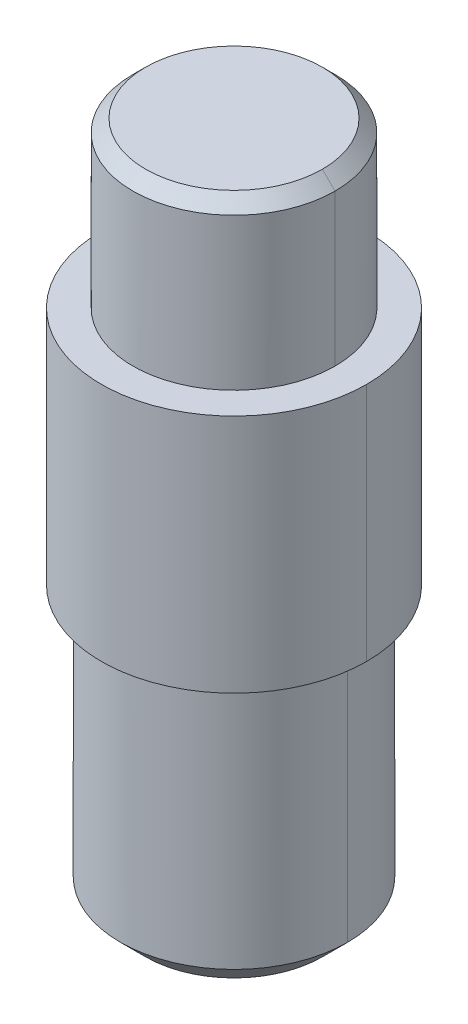
ISO-10303-21;
HEADER;
FILE_DESCRIPTION(('STEP AP214'),'2;1');
FILE_NAME('part.step','',(''),(''),'','','');
FILE_SCHEMA(('AUTOMOTIVE_DESIGN { 1 0 10303 214 1 1 1 1 }'));
ENDSEC;
DATA;
#1=APPLICATION_CONTEXT('core data for automotive mechanical design processes');
#2=APPLICATION_PROTOCOL_DEFINITION('international standard','automotive_design',2000,#1);
#3=PRODUCT_CONTEXT('',#1,'mechanical');
#4=PRODUCT('Part','Part','',(#3));
#5=PRODUCT_RELATED_PRODUCT_CATEGORY('part','',(#4));
#6=PRODUCT_DEFINITION_FORMATION('','',#4);
#7=PRODUCT_DEFINITION_CONTEXT('part definition',#1,'design');
#8=PRODUCT_DEFINITION('design','',#6,#7);
#9=PRODUCT_DEFINITION_SHAPE('','',#8);
#10=(LENGTH_UNIT() NAMED_UNIT(*) SI_UNIT(.MILLI.,.METRE.));
#11=(NAMED_UNIT(*) PLANE_ANGLE_UNIT() SI_UNIT($,.RADIAN.));
#12=(NAMED_UNIT(*) SI_UNIT($,.STERADIAN.) SOLID_ANGLE_UNIT());
#13=UNCERTAINTY_MEASURE_WITH_UNIT(LENGTH_MEASURE(1.E-05),#10,'distance_accuracy_value','');
#14=(GEOMETRIC_REPRESENTATION_CONTEXT(3) GLOBAL_UNCERTAINTY_ASSIGNED_CONTEXT((#13)) GLOBAL_UNIT_ASSIGNED_CONTEXT((#10,
#11,#12)) REPRESENTATION_CONTEXT('',''));
#15=CARTESIAN_POINT('',(0.,0.,0.));
#16=DIRECTION('',(0.,0.,1.));
#17=DIRECTION('',(1.,0.,0.));
#18=AXIS2_PLACEMENT_3D('',#15,#16,#17);
#19=CARTESIAN_POINT('',(0.,0.,0.));
#20=DIRECTION('',(0.,1.,0.));
#21=DIRECTION('',(1.,0.,0.));
#22=AXIS2_PLACEMENT_3D('',#19,#20,#21);
#23=PLANE('',#22);
#24=CARTESIAN_POINT('',(0.,-1.50990331349E-13,0.));
#25=DIRECTION('',(0.,1.,0.));
#26=DIRECTION('',(0.,0.,1.));
#27=AXIS2_PLACEMENT_3D('',#24,#25,#26);
#28=CIRCLE('',#27,3.5);
#29=CARTESIAN_POINT('',(0.,-1.50990331349E-13,3.5));
#30=VERTEX_POINT('',#29);
#31=CARTESIAN_POINT('',(3.5,-1.50990331349E-13,0.));
#32=VERTEX_POINT('',#31);
#33=EDGE_CURVE('E42',#30,#32,#28,.T.);
#34=ORIENTED_EDGE('',*,*,#33,.F.);
#35=CARTESIAN_POINT('',(0.,-1.50990331349E-13,0.));
#36=DIRECTION('',(0.,1.,0.));
#37=DIRECTION('',(-1.,0.,0.));
#38=AXIS2_PLACEMENT_3D('',#35,#36,#37);
#39=CIRCLE('',#38,3.5);
#40=CARTESIAN_POINT('',(-3.5,-1.50990331349E-13,0.));
#41=VERTEX_POINT('',#40);
#42=EDGE_CURVE('E161',#41,#30,#39,.T.);
#43=ORIENTED_EDGE('',*,*,#42,.F.);
#44=CARTESIAN_POINT('',(0.,-1.50990331349E-13,0.));
#45=DIRECTION('',(0.,1.,0.));
#46=DIRECTION('',(0.,0.,-1.));
#47=AXIS2_PLACEMENT_3D('',#44,#45,#46);
#48=CIRCLE('',#47,3.5);
#49=CARTESIAN_POINT('',(0.,-1.50990331349E-13,-3.5));
#50=VERTEX_POINT('',#49);
#51=EDGE_CURVE('E159',#50,#41,#48,.T.);
#52=ORIENTED_EDGE('',*,*,#51,.F.);
#53=CARTESIAN_POINT('',(0.,-1.50990331349E-13,0.));
#54=DIRECTION('',(0.,1.,0.));
#55=DIRECTION('',(1.,0.,0.));
#56=AXIS2_PLACEMENT_3D('',#53,#54,#55);
#57=CIRCLE('',#56,3.5);
#58=EDGE_CURVE('E28',#32,#50,#57,.T.);
#59=ORIENTED_EDGE('',*,*,#58,.F.);
#60=EDGE_LOOP('',(#34,#43,#52,#59));
#61=FACE_BOUND('',#60,.T.);
#62=ADVANCED_FACE('F17',(#61),#23,.F.);
#63=CARTESIAN_POINT('',(0.,0.4999999999999,0.));
#64=DIRECTION('',(0.,1.,0.));
#65=DIRECTION('',(0.,0.,-1.));
#66=AXIS2_PLACEMENT_3D('',#63,#64,#65);
#67=CONICAL_SURFACE('',#66,4.,0.7853981633973);
#68=DIRECTION('',(0.707106781186498,-0.707106781186597,-5.68588450313498E-12));
#69=VECTOR('',#68,1.);
#70=CARTESIAN_POINT('',(-4.5,0.9999999999999,-2.171026979362E-10));
#71=LINE('',#70,#69);
#72=CARTESIAN_POINT('',(-4.5,0.9999999999998,0.));
#73=VERTEX_POINT('',#72);
#74=EDGE_CURVE('E150',#73,#41,#71,.T.);
#75=ORIENTED_EDGE('',*,*,#74,.F.);
#76=CARTESIAN_POINT('',(0.,0.9999999999998,0.));
#77=DIRECTION('',(0.,1.,0.));
#78=DIRECTION('',(0.,0.,-1.));
#79=AXIS2_PLACEMENT_3D('',#76,#77,#78);
#80=CIRCLE('',#79,4.5);
#81=CARTESIAN_POINT('',(0.,0.9999999999998,-4.5));
#82=VERTEX_POINT('',#81);
#83=EDGE_CURVE('E128',#82,#73,#80,.T.);
#84=ORIENTED_EDGE('',*,*,#83,.F.);
#85=CARTESIAN_POINT('',(0.,0.9999999999998,0.));
#86=DIRECTION('',(0.,1.,0.));
#87=DIRECTION('',(1.,0.,4.202093083896E-11));
#88=AXIS2_PLACEMENT_3D('',#85,#86,#87);
#89=CIRCLE('',#88,4.5);
#90=CARTESIAN_POINT('',(4.5,0.9999999999999,3.11649568269E-10));
#91=VERTEX_POINT('',#90);
#92=EDGE_CURVE('E140',#91,#82,#89,.T.);
#93=ORIENTED_EDGE('',*,*,#92,.F.);
#94=DIRECTION('',(-0.707106781186498,-0.707106781186597,-6.11692150040798E-11));
#95=VECTOR('',#94,1.);
#96=CARTESIAN_POINT('',(4.5,0.9999999999999,3.11649568269E-10));
#97=LINE('',#96,#95);
#98=EDGE_CURVE('E11',#91,#32,#97,.T.);
#99=ORIENTED_EDGE('',*,*,#98,.T.);
#100=ORIENTED_EDGE('',*,*,#58,.T.);
#101=ORIENTED_EDGE('',*,*,#51,.T.);
#102=EDGE_LOOP('',(#75,#84,#93,#99,#100,#101));
#103=FACE_BOUND('',#102,.T.);
#104=ADVANCED_FACE('F156',(#103),#67,.T.);
#105=CARTESIAN_POINT('',(0.,0.4999999999999,0.));
#106=DIRECTION('',(0.,1.,0.));
#107=DIRECTION('',(0.,0.,-1.));
#108=AXIS2_PLACEMENT_3D('',#105,#106,#107);
#109=CONICAL_SURFACE('',#108,4.,0.7853981633973);
#110=ORIENTED_EDGE('',*,*,#98,.F.);
#111=CARTESIAN_POINT('',(0.,0.9999999999998,0.));
#112=DIRECTION('',(0.,1.,0.));
#113=DIRECTION('',(0.,0.,1.));
#114=AXIS2_PLACEMENT_3D('',#111,#112,#113);
#115=CIRCLE('',#114,4.5);
#116=CARTESIAN_POINT('',(0.,0.9999999999998,4.5));
#117=VERTEX_POINT('',#116);
#118=EDGE_CURVE('E152',#117,#91,#115,.T.);
#119=ORIENTED_EDGE('',*,*,#118,.F.);
#120=CARTESIAN_POINT('',(0.,0.9999999999998,0.));
#121=DIRECTION('',(0.,1.,0.));
#122=DIRECTION('',(-1.,0.,0.));
#123=AXIS2_PLACEMENT_3D('',#120,#121,#122);
#124=CIRCLE('',#123,4.5);
#125=EDGE_CURVE('E147',#73,#117,#124,.T.);
#126=ORIENTED_EDGE('',*,*,#125,.F.);
#127=ORIENTED_EDGE('',*,*,#74,.T.);
#128=ORIENTED_EDGE('',*,*,#42,.T.);
#129=ORIENTED_EDGE('',*,*,#33,.T.);
#130=EDGE_LOOP('',(#110,#119,#126,#127,#128,#129));
#131=FACE_BOUND('',#130,.T.);
#132=ADVANCED_FACE('F149',(#131),#109,.T.);
#133=CARTESIAN_POINT('',(0.,0.,0.));
#134=DIRECTION('',(0.,-1.,0.));
#135=DIRECTION('',(-1.,0.,0.));
#136=AXIS2_PLACEMENT_3D('',#133,#134,#135);
#137=CYLINDRICAL_SURFACE('',#136,4.5);
#138=DIRECTION('',(0.,-1.,1.855866841859E-11));
#139=VECTOR('',#138,1.);
#140=CARTESIAN_POINT('',(4.5,11.,1.260628840831E-10));
#141=LINE('',#140,#139);
#142=CARTESIAN_POINT('',(4.5,11.,0.));
#143=VERTEX_POINT('',#142);
#144=EDGE_CURVE('E251',#143,#91,#141,.T.);
#145=ORIENTED_EDGE('',*,*,#144,.F.);
#146=CARTESIAN_POINT('',(0.,11.,0.));
#147=DIRECTION('',(0.,-1.,0.));
#148=DIRECTION('',(1.,0.,0.));
#149=AXIS2_PLACEMENT_3D('',#146,#147,#148);
#150=CIRCLE('',#149,4.5);
#151=CARTESIAN_POINT('',(-4.5,11.,0.));
#152=VERTEX_POINT('',#151);
#153=EDGE_CURVE('E165',#143,#152,#150,.T.);
#154=ORIENTED_EDGE('',*,*,#153,.T.);
#155=DIRECTION('',(0.,-1.,-2.17102973764E-11));
#156=VECTOR('',#155,1.);
#157=CARTESIAN_POINT('',(-4.5,11.,0.));
#158=LINE('',#157,#156);
#159=EDGE_CURVE('E137',#152,#73,#158,.T.);
#160=ORIENTED_EDGE('',*,*,#159,.T.);
#161=ORIENTED_EDGE('',*,*,#125,.T.);
#162=ORIENTED_EDGE('',*,*,#118,.T.);
#163=EDGE_LOOP('',(#145,#154,#160,#161,#162));
#164=FACE_BOUND('',#163,.T.);
#165=ADVANCED_FACE('F163',(#164),#137,.T.);
#166=CARTESIAN_POINT('',(0.,0.,0.));
#167=DIRECTION('',(0.,-1.,0.));
#168=DIRECTION('',(-1.,0.,0.));
#169=AXIS2_PLACEMENT_3D('',#166,#167,#168);
#170=CYLINDRICAL_SURFACE('',#169,4.5);
#171=ORIENTED_EDGE('',*,*,#159,.F.);
#172=CARTESIAN_POINT('',(0.,11.,0.));
#173=DIRECTION('',(0.,-1.,0.));
#174=DIRECTION('',(-1.,0.,0.));
#175=AXIS2_PLACEMENT_3D('',#172,#173,#174);
#176=CIRCLE('',#175,4.5);
#177=EDGE_CURVE('E224',#152,#143,#176,.T.);
#178=ORIENTED_EDGE('',*,*,#177,.T.);
#179=ORIENTED_EDGE('',*,*,#144,.T.);
#180=ORIENTED_EDGE('',*,*,#92,.T.);
#181=ORIENTED_EDGE('',*,*,#83,.T.);
#182=EDGE_LOOP('',(#171,#178,#179,#180,#181));
#183=FACE_BOUND('',#182,.T.);
#184=ADVANCED_FACE('F134',(#183),#170,.T.);
#185=CARTESIAN_POINT('',(0.,11.,0.));
#186=DIRECTION('',(0.,-1.,0.));
#187=DIRECTION('',(0.,0.,-1.));
#188=AXIS2_PLACEMENT_3D('',#185,#186,#187);
#189=PLANE('',#188);
#190=CARTESIAN_POINT('',(0.,11.,0.));
#191=DIRECTION('',(0.,1.,0.));
#192=DIRECTION('',(-1.,0.,0.));
#193=AXIS2_PLACEMENT_3D('',#190,#191,#192);
#194=CIRCLE('',#193,5.25);
#195=CARTESIAN_POINT('',(-5.25,11.,0.));
#196=VERTEX_POINT('',#195);
#197=CARTESIAN_POINT('',(5.25,11.,0.));
#198=VERTEX_POINT('',#197);
#199=EDGE_CURVE('E181',#196,#198,#194,.T.);
#200=ORIENTED_EDGE('',*,*,#199,.F.);
#201=CARTESIAN_POINT('',(0.,11.,0.));
#202=DIRECTION('',(0.,1.,0.));
#203=DIRECTION('',(1.,0.,0.));
#204=AXIS2_PLACEMENT_3D('',#201,#202,#203);
#205=CIRCLE('',#204,5.25);
#206=EDGE_CURVE('E174',#198,#196,#205,.T.);
#207=ORIENTED_EDGE('',*,*,#206,.F.);
#208=EDGE_LOOP('',(#200,#207));
#209=FACE_BOUND('',#208,.T.);
#210=ORIENTED_EDGE('',*,*,#177,.F.);
#211=ORIENTED_EDGE('',*,*,#153,.F.);
#212=EDGE_LOOP('',(#210,#211));
#213=FACE_BOUND('',#212,.T.);
#214=ADVANCED_FACE('F287',(#209,#213),#189,.T.);
#215=CARTESIAN_POINT('',(0.,0.,0.));
#216=DIRECTION('',(0.,1.,0.));
#217=DIRECTION('',(1.,0.,0.));
#218=AXIS2_PLACEMENT_3D('',#215,#216,#217);
#219=CYLINDRICAL_SURFACE('',#218,5.25);
#220=DIRECTION('',(0.,-1.,0.));
#221=VECTOR('',#220,1.);
#222=CARTESIAN_POINT('',(-5.25,20.5,0.));
#223=LINE('',#222,#221);
#224=CARTESIAN_POINT('',(-5.25,20.5,0.));
#225=VERTEX_POINT('',#224);
#226=EDGE_CURVE('E187',#225,#196,#223,.T.);
#227=ORIENTED_EDGE('',*,*,#226,.F.);
#228=CARTESIAN_POINT('',(0.,20.5,0.));
#229=DIRECTION('',(0.,-1.,0.));
#230=DIRECTION('',(-1.,0.,0.));
#231=AXIS2_PLACEMENT_3D('',#228,#229,#230);
#232=CIRCLE('',#231,5.25);
#233=CARTESIAN_POINT('',(5.25,20.5,0.));
#234=VERTEX_POINT('',#233);
#235=EDGE_CURVE('E142',#225,#234,#232,.T.);
#236=ORIENTED_EDGE('',*,*,#235,.T.);
#237=DIRECTION('',(0.,-1.,0.));
#238=VECTOR('',#237,1.);
#239=CARTESIAN_POINT('',(5.25,20.5,0.));
#240=LINE('',#239,#238);
#241=EDGE_CURVE('E233',#234,#198,#240,.T.);
#242=ORIENTED_EDGE('',*,*,#241,.T.);
#243=ORIENTED_EDGE('',*,*,#206,.T.);
#244=EDGE_LOOP('',(#227,#236,#242,#243));
#245=FACE_BOUND('',#244,.T.);
#246=ADVANCED_FACE('F301',(#245),#219,.T.);
#247=CARTESIAN_POINT('',(0.,0.,0.));
#248=DIRECTION('',(0.,1.,0.));
#249=DIRECTION('',(1.,0.,0.));
#250=AXIS2_PLACEMENT_3D('',#247,#248,#249);
#251=CYLINDRICAL_SURFACE('',#250,5.25);
#252=ORIENTED_EDGE('',*,*,#241,.F.);
#253=CARTESIAN_POINT('',(0.,20.5,0.));
#254=DIRECTION('',(0.,-1.,0.));
#255=DIRECTION('',(1.,0.,0.));
#256=AXIS2_PLACEMENT_3D('',#253,#254,#255);
#257=CIRCLE('',#256,5.25);
#258=EDGE_CURVE('E191',#234,#225,#257,.T.);
#259=ORIENTED_EDGE('',*,*,#258,.T.);
#260=ORIENTED_EDGE('',*,*,#226,.T.);
#261=ORIENTED_EDGE('',*,*,#199,.T.);
#262=EDGE_LOOP('',(#252,#259,#260,#261));
#263=FACE_BOUND('',#262,.T.);
#264=ADVANCED_FACE('F295',(#263),#251,.T.);
#265=CARTESIAN_POINT('',(0.,20.5,0.));
#266=DIRECTION('',(0.,1.,0.));
#267=DIRECTION('',(1.,0.,0.));
#268=AXIS2_PLACEMENT_3D('',#265,#266,#267);
#269=PLANE('',#268);
#270=ORIENTED_EDGE('',*,*,#258,.F.);
#271=ORIENTED_EDGE('',*,*,#235,.F.);
#272=EDGE_LOOP('',(#270,#271));
#273=FACE_BOUND('',#272,.T.);
#274=CARTESIAN_POINT('',(0.,20.5,0.));
#275=DIRECTION('',(0.,1.,0.));
#276=DIRECTION('',(1.,0.,0.));
#277=AXIS2_PLACEMENT_3D('',#274,#275,#276);
#278=CIRCLE('',#277,4.);
#279=CARTESIAN_POINT('',(4.,20.5,0.));
#280=VERTEX_POINT('',#279);
#281=CARTESIAN_POINT('',(-4.,20.5,0.));
#282=VERTEX_POINT('',#281);
#283=EDGE_CURVE('E213',#280,#282,#278,.T.);
#284=ORIENTED_EDGE('',*,*,#283,.F.);
#285=CARTESIAN_POINT('',(0.,20.5,0.));
#286=DIRECTION('',(0.,1.,0.));
#287=DIRECTION('',(-1.,0.,0.));
#288=AXIS2_PLACEMENT_3D('',#285,#286,#287);
#289=CIRCLE('',#288,4.);
#290=EDGE_CURVE('E177',#282,#280,#289,.T.);
#291=ORIENTED_EDGE('',*,*,#290,.F.);
#292=EDGE_LOOP('',(#284,#291));
#293=FACE_BOUND('',#292,.T.);
#294=ADVANCED_FACE('F300',(#273,#293),#269,.T.);
#295=CARTESIAN_POINT('',(0.,27.,0.));
#296=DIRECTION('',(0.,1.,0.));
#297=DIRECTION('',(1.,0.,0.));
#298=AXIS2_PLACEMENT_3D('',#295,#296,#297);
#299=CYLINDRICAL_SURFACE('',#298,4.);
#300=DIRECTION('',(1.249370977045E-13,1.,9.466622125551E-11));
#301=VECTOR('',#300,1.);
#302=CARTESIAN_POINT('',(-4.,20.5,3.824422769232E-10));
#303=LINE('',#302,#301);
#304=CARTESIAN_POINT('',(-3.999999999999,26.5,5.736632932843E-10));
#305=VERTEX_POINT('',#304);
#306=EDGE_CURVE('E217',#282,#305,#303,.T.);
#307=ORIENTED_EDGE('',*,*,#306,.F.);
#308=ORIENTED_EDGE('',*,*,#290,.T.);
#309=DIRECTION('',(-1.249370977045E-13,1.,-1.10601252328E-10));
#310=VECTOR('',#309,1.);
#311=CARTESIAN_POINT('',(4.,20.5,0.));
#312=LINE('',#311,#310);
#313=CARTESIAN_POINT('',(3.999999999999,26.5,0.));
#314=VERTEX_POINT('',#313);
#315=EDGE_CURVE('E182',#280,#314,#312,.T.);
#316=ORIENTED_EDGE('',*,*,#315,.T.);
#317=CARTESIAN_POINT('',(0.,26.5,0.));
#318=DIRECTION('',(0.,-1.,0.));
#319=DIRECTION('',(1.,0.,0.));
#320=AXIS2_PLACEMENT_3D('',#317,#318,#319);
#321=CIRCLE('',#320,3.999999999999);
#322=CARTESIAN_POINT('',(0.,26.5,3.999999999999));
#323=VERTEX_POINT('',#322);
#324=EDGE_CURVE('E21',#314,#323,#321,.T.);
#325=ORIENTED_EDGE('',*,*,#324,.T.);
#326=CARTESIAN_POINT('',(0.,26.5,0.));
#327=DIRECTION('',(0.,-1.,0.));
#328=DIRECTION('',(0.,0.,1.));
#329=AXIS2_PLACEMENT_3D('',#326,#327,#328);
#330=CIRCLE('',#329,3.999999999999);
#331=EDGE_CURVE('E196',#323,#305,#330,.T.);
#332=ORIENTED_EDGE('',*,*,#331,.T.);
#333=EDGE_LOOP('',(#307,#308,#316,#325,#332));
#334=FACE_BOUND('',#333,.T.);
#335=ADVANCED_FACE('F275',(#334),#299,.T.);
#336=CARTESIAN_POINT('',(0.,26.75,0.));
#337=DIRECTION('',(0.,-1.,0.));
#338=DIRECTION('',(0.,0.,-1.));
#339=AXIS2_PLACEMENT_3D('',#336,#337,#338);
#340=CONICAL_SURFACE('',#339,3.749999999999,0.7853981633973);
#341=DIRECTION('',(0.707106781186897,0.707106781186198,-2.49227410153099E-10));
#342=VECTOR('',#341,1.);
#343=CARTESIAN_POINT('',(-3.999999999999,26.5,9.504396044562E-10));
#344=LINE('',#343,#342);
#345=CARTESIAN_POINT('',(-3.499999999999,27.,0.));
#346=VERTEX_POINT('',#345);
#347=EDGE_CURVE('E210',#305,#346,#344,.T.);
#348=ORIENTED_EDGE('',*,*,#347,.F.);
#349=ORIENTED_EDGE('',*,*,#331,.F.);
#350=ORIENTED_EDGE('',*,*,#324,.F.);
#351=DIRECTION('',(-0.707106781186897,0.707106781186198,-1.564140363558E-10));
#352=VECTOR('',#351,1.);
#353=CARTESIAN_POINT('',(3.999999999999,26.5,-6.636072687953E-10));
#354=LINE('',#353,#352);
#355=CARTESIAN_POINT('',(3.499999999999,27.,0.));
#356=VERTEX_POINT('',#355);
#357=EDGE_CURVE('E192',#314,#356,#354,.T.);
#358=ORIENTED_EDGE('',*,*,#357,.T.);
#359=CARTESIAN_POINT('',(0.,27.,0.));
#360=DIRECTION('',(0.,-1.,0.));
#361=DIRECTION('',(1.,0.,0.));
#362=AXIS2_PLACEMENT_3D('',#359,#360,#361);
#363=CIRCLE('',#362,3.499999999999);
#364=CARTESIAN_POINT('',(0.,27.,3.499999999999));
#365=VERTEX_POINT('',#364);
#366=EDGE_CURVE('E197',#356,#365,#363,.T.);
#367=ORIENTED_EDGE('',*,*,#366,.T.);
#368=CARTESIAN_POINT('',(0.,27.,0.));
#369=DIRECTION('',(0.,-1.,0.));
#370=DIRECTION('',(0.,0.,1.));
#371=AXIS2_PLACEMENT_3D('',#368,#369,#370);
#372=CIRCLE('',#371,3.499999999999);
#373=EDGE_CURVE('E206',#365,#346,#372,.T.);
#374=ORIENTED_EDGE('',*,*,#373,.T.);
#375=EDGE_LOOP('',(#348,#349,#350,#358,#367,#374));
#376=FACE_BOUND('',#375,.T.);
#377=ADVANCED_FACE('F264',(#376),#340,.T.);
#378=CARTESIAN_POINT('',(0.,27.,0.));
#379=DIRECTION('',(0.,1.,0.));
#380=DIRECTION('',(1.,0.,0.));
#381=AXIS2_PLACEMENT_3D('',#378,#379,#380);
#382=PLANE('',#381);
#383=CARTESIAN_POINT('',(0.,27.,0.));
#384=DIRECTION('',(0.,-1.,0.));
#385=DIRECTION('',(0.,0.,-1.));
#386=AXIS2_PLACEMENT_3D('',#383,#384,#385);
#387=CIRCLE('',#386,3.499999999999);
#388=CARTESIAN_POINT('',(0.,27.,-3.499999999999));
#389=VERTEX_POINT('',#388);
#390=EDGE_CURVE('E216',#389,#356,#387,.T.);
#391=ORIENTED_EDGE('',*,*,#390,.F.);
#392=CARTESIAN_POINT('',(0.,27.,0.));
#393=DIRECTION('',(0.,-1.,0.));
#394=DIRECTION('',(-1.,0.,0.));
#395=AXIS2_PLACEMENT_3D('',#392,#393,#394);
#396=CIRCLE('',#395,3.499999999999);
#397=EDGE_CURVE('E218',#346,#389,#396,.T.);
#398=ORIENTED_EDGE('',*,*,#397,.F.);
#399=ORIENTED_EDGE('',*,*,#373,.F.);
#400=ORIENTED_EDGE('',*,*,#366,.F.);
#401=EDGE_LOOP('',(#391,#398,#399,#400));
#402=FACE_BOUND('',#401,.T.);
#403=ADVANCED_FACE('F268',(#402),#382,.T.);
#404=CARTESIAN_POINT('',(0.,26.75,0.));
#405=DIRECTION('',(0.,-1.,0.));
#406=DIRECTION('',(0.,0.,-1.));
#407=AXIS2_PLACEMENT_3D('',#404,#405,#406);
#408=CONICAL_SURFACE('',#407,3.749999999999,0.7853981633973);
#409=ORIENTED_EDGE('',*,*,#357,.F.);
#410=CARTESIAN_POINT('',(0.,26.5,0.));
#411=DIRECTION('',(0.,-1.,0.));
#412=DIRECTION('',(0.,0.,-1.));
#413=AXIS2_PLACEMENT_3D('',#410,#411,#412);
#414=CIRCLE('',#413,3.999999999999);
#415=CARTESIAN_POINT('',(0.,26.5,-3.999999999999));
#416=VERTEX_POINT('',#415);
#417=EDGE_CURVE('E201',#416,#314,#414,.T.);
#418=ORIENTED_EDGE('',*,*,#417,.F.);
#419=CARTESIAN_POINT('',(0.,26.5,0.));
#420=DIRECTION('',(0.,-1.,0.));
#421=DIRECTION('',(-1.,0.,1.434158233211E-10));
#422=AXIS2_PLACEMENT_3D('',#419,#420,#421);
#423=CIRCLE('',#422,3.999999999999);
#424=EDGE_CURVE('E205',#305,#416,#423,.T.);
#425=ORIENTED_EDGE('',*,*,#424,.F.);
#426=ORIENTED_EDGE('',*,*,#347,.T.);
#427=ORIENTED_EDGE('',*,*,#397,.T.);
#428=ORIENTED_EDGE('',*,*,#390,.T.);
#429=EDGE_LOOP('',(#409,#418,#425,#426,#427,#428));
#430=FACE_BOUND('',#429,.T.);
#431=ADVANCED_FACE('F19',(#430),#408,.T.);
#432=CARTESIAN_POINT('',(0.,27.,0.));
#433=DIRECTION('',(0.,1.,0.));
#434=DIRECTION('',(1.,0.,0.));
#435=AXIS2_PLACEMENT_3D('',#432,#433,#434);
#436=CYLINDRICAL_SURFACE('',#435,4.);
#437=ORIENTED_EDGE('',*,*,#315,.F.);
#438=ORIENTED_EDGE('',*,*,#283,.T.);
#439=ORIENTED_EDGE('',*,*,#306,.T.);
#440=ORIENTED_EDGE('',*,*,#424,.T.);
#441=ORIENTED_EDGE('',*,*,#417,.T.);
#442=EDGE_LOOP('',(#437,#438,#439,#440,#441));
#443=FACE_BOUND('',#442,.T.);
#444=ADVANCED_FACE('F336',(#443),#436,.T.);
#445=CLOSED_SHELL('',(#62,#104,#132,#165,#184,#214,#246,#264,#294,#335,#377,#403,#431,#444));
#446=MANIFOLD_SOLID_BREP('B1',#445);
#447=ADVANCED_BREP_SHAPE_REPRESENTATION('',(#18,#446),#14);
#448=SHAPE_DEFINITION_REPRESENTATION(#9,#447);
ENDSEC;
END-ISO-10303-21;
